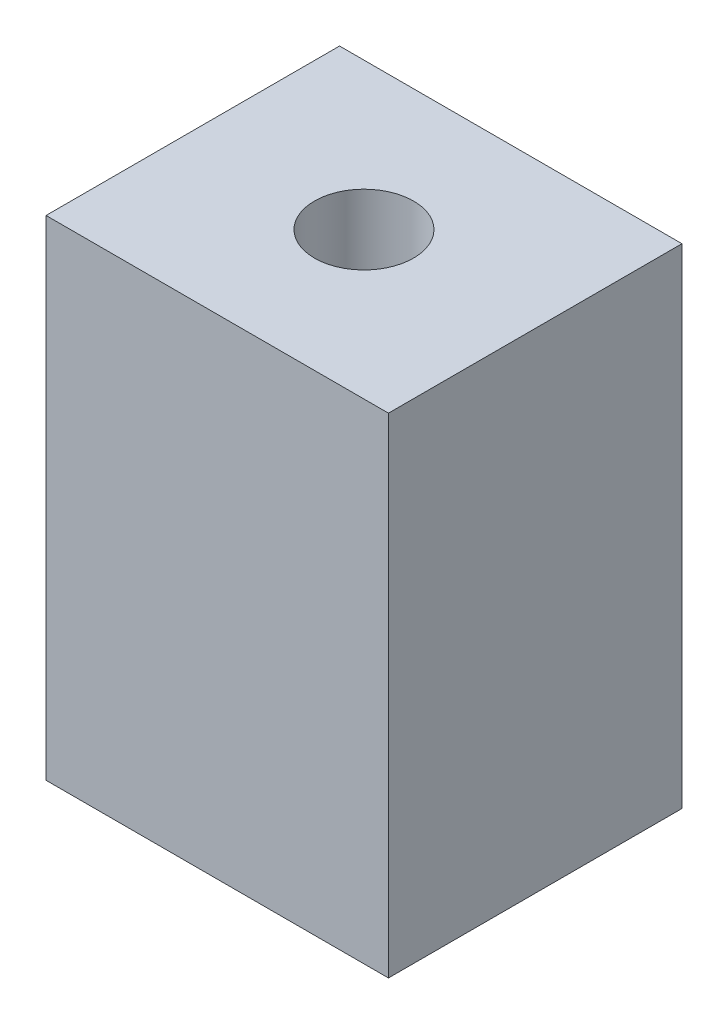
ISO-10303-21;
HEADER;
FILE_DESCRIPTION(('STEP AP214'),'2;1');
FILE_NAME('part.step','',(''),(''),'','','');
FILE_SCHEMA(('AUTOMOTIVE_DESIGN { 1 0 10303 214 1 1 1 1 }'));
ENDSEC;
DATA;
#1=APPLICATION_CONTEXT('core data for automotive mechanical design processes');
#2=APPLICATION_PROTOCOL_DEFINITION('international standard','automotive_design',2000,#1);
#3=PRODUCT_CONTEXT('',#1,'mechanical');
#4=PRODUCT('Part','Part','',(#3));
#5=PRODUCT_RELATED_PRODUCT_CATEGORY('part','',(#4));
#6=PRODUCT_DEFINITION_FORMATION('','',#4);
#7=PRODUCT_DEFINITION_CONTEXT('part definition',#1,'design');
#8=PRODUCT_DEFINITION('design','',#6,#7);
#9=PRODUCT_DEFINITION_SHAPE('','',#8);
#10=(LENGTH_UNIT() NAMED_UNIT(*) SI_UNIT(.MILLI.,.METRE.));
#11=(NAMED_UNIT(*) PLANE_ANGLE_UNIT() SI_UNIT($,.RADIAN.));
#12=(NAMED_UNIT(*) SI_UNIT($,.STERADIAN.) SOLID_ANGLE_UNIT());
#13=UNCERTAINTY_MEASURE_WITH_UNIT(LENGTH_MEASURE(1.E-05),#10,'distance_accuracy_value','');
#14=(GEOMETRIC_REPRESENTATION_CONTEXT(3) GLOBAL_UNCERTAINTY_ASSIGNED_CONTEXT((#13)) GLOBAL_UNIT_ASSIGNED_CONTEXT((#10,
#11,#12)) REPRESENTATION_CONTEXT('',''));
#15=CARTESIAN_POINT('',(0.,0.,0.));
#16=DIRECTION('',(0.,0.,1.));
#17=DIRECTION('',(1.,0.,0.));
#18=AXIS2_PLACEMENT_3D('',#15,#16,#17);
#19=CARTESIAN_POINT('',(1.74456666474761,50.,9.64810597925036));
#20=DIRECTION('',(1.,0.,0.));
#21=DIRECTION('',(0.,0.,-1.));
#22=AXIS2_PLACEMENT_3D('',#19,#20,#21);
#23=PLANE('',#22);
#24=DIRECTION('',(0.,0.,1.));
#25=VECTOR('',#24,1.);
#26=CARTESIAN_POINT('',(1.74456666474761,0.,9.64810597925036));
#27=LINE('',#26,#25);
#28=CARTESIAN_POINT('',(1.74456666474761,0.,-20.3518940207496));
#29=VERTEX_POINT('',#28);
#30=CARTESIAN_POINT('',(1.74456666474761,0.,9.64810597925036));
#31=VERTEX_POINT('',#30);
#32=EDGE_CURVE('E107',#29,#31,#27,.T.);
#33=ORIENTED_EDGE('',*,*,#32,.T.);
#34=DIRECTION('',(0.,-1.,0.));
#35=VECTOR('',#34,1.);
#36=CARTESIAN_POINT('',(1.74456666474761,50.,9.64810597925036));
#37=LINE('',#36,#35);
#38=CARTESIAN_POINT('',(1.74456666474761,50.,9.64810597925036));
#39=VERTEX_POINT('',#38);
#40=EDGE_CURVE('E11',#39,#31,#37,.T.);
#41=ORIENTED_EDGE('',*,*,#40,.F.);
#42=DIRECTION('',(0.,0.,1.));
#43=VECTOR('',#42,1.);
#44=CARTESIAN_POINT('',(1.74456666474761,50.,9.64810597925036));
#45=LINE('',#44,#43);
#46=CARTESIAN_POINT('',(1.74456666474761,50.,-20.3518940207496));
#47=VERTEX_POINT('',#46);
#48=EDGE_CURVE('E91',#47,#39,#45,.T.);
#49=ORIENTED_EDGE('',*,*,#48,.F.);
#50=DIRECTION('',(0.,-1.,0.));
#51=VECTOR('',#50,1.);
#52=CARTESIAN_POINT('',(1.74456666474761,50.,-20.3518940207496));
#53=LINE('',#52,#51);
#54=EDGE_CURVE('E103',#47,#29,#53,.T.);
#55=ORIENTED_EDGE('',*,*,#54,.T.);
#56=EDGE_LOOP('',(#33,#41,#49,#55));
#57=FACE_BOUND('',#56,.T.);
#58=ADVANCED_FACE('F39',(#57),#23,.F.);
#59=CARTESIAN_POINT('',(1.74456666474761,50.,9.64810597925036));
#60=DIRECTION('',(0.,0.,-1.));
#61=DIRECTION('',(-1.,0.,0.));
#62=AXIS2_PLACEMENT_3D('',#59,#60,#61);
#63=PLANE('',#62);
#64=DIRECTION('',(1.,0.,0.));
#65=VECTOR('',#64,1.);
#66=CARTESIAN_POINT('',(1.74456666474761,0.,9.64810597925036));
#67=LINE('',#66,#65);
#68=CARTESIAN_POINT('',(36.7445666647476,0.,9.64810597925036));
#69=VERTEX_POINT('',#68);
#70=EDGE_CURVE('E96',#31,#69,#67,.T.);
#71=ORIENTED_EDGE('',*,*,#70,.T.);
#72=DIRECTION('',(0.,-1.,0.));
#73=VECTOR('',#72,1.);
#74=CARTESIAN_POINT('',(36.7445666647476,50.,9.64810597925036));
#75=LINE('',#74,#73);
#76=CARTESIAN_POINT('',(36.7445666647476,50.,9.64810597925036));
#77=VERTEX_POINT('',#76);
#78=EDGE_CURVE('E48',#77,#69,#75,.T.);
#79=ORIENTED_EDGE('',*,*,#78,.F.);
#80=DIRECTION('',(1.,0.,0.));
#81=VECTOR('',#80,1.);
#82=CARTESIAN_POINT('',(1.74456666474761,50.,9.64810597925036));
#83=LINE('',#82,#81);
#84=EDGE_CURVE('E86',#39,#77,#83,.T.);
#85=ORIENTED_EDGE('',*,*,#84,.F.);
#86=ORIENTED_EDGE('',*,*,#40,.T.);
#87=EDGE_LOOP('',(#71,#79,#85,#86));
#88=FACE_BOUND('',#87,.T.);
#89=ADVANCED_FACE('F95',(#88),#63,.F.);
#90=CARTESIAN_POINT('',(36.7445666647476,50.,9.64810597925036));
#91=DIRECTION('',(-1.,0.,0.));
#92=DIRECTION('',(0.,0.,1.));
#93=AXIS2_PLACEMENT_3D('',#90,#91,#92);
#94=PLANE('',#93);
#95=DIRECTION('',(0.,0.,-1.));
#96=VECTOR('',#95,1.);
#97=CARTESIAN_POINT('',(36.7445666647476,0.,9.64810597925036));
#98=LINE('',#97,#96);
#99=CARTESIAN_POINT('',(36.7445666647476,0.,-20.3518940207496));
#100=VERTEX_POINT('',#99);
#101=EDGE_CURVE('E73',#69,#100,#98,.T.);
#102=ORIENTED_EDGE('',*,*,#101,.T.);
#103=DIRECTION('',(0.,-1.,0.));
#104=VECTOR('',#103,1.);
#105=CARTESIAN_POINT('',(36.7445666647476,50.,-20.3518940207496));
#106=LINE('',#105,#104);
#107=CARTESIAN_POINT('',(36.7445666647476,50.,-20.3518940207496));
#108=VERTEX_POINT('',#107);
#109=EDGE_CURVE('E98',#108,#100,#106,.T.);
#110=ORIENTED_EDGE('',*,*,#109,.F.);
#111=DIRECTION('',(0.,0.,-1.));
#112=VECTOR('',#111,1.);
#113=CARTESIAN_POINT('',(36.7445666647476,50.,9.64810597925036));
#114=LINE('',#113,#112);
#115=EDGE_CURVE('E89',#77,#108,#114,.T.);
#116=ORIENTED_EDGE('',*,*,#115,.F.);
#117=ORIENTED_EDGE('',*,*,#78,.T.);
#118=EDGE_LOOP('',(#102,#110,#116,#117));
#119=FACE_BOUND('',#118,.T.);
#120=ADVANCED_FACE('F99',(#119),#94,.F.);
#121=CARTESIAN_POINT('',(1.74456666474761,50.,-20.3518940207496));
#122=DIRECTION('',(0.,0.,1.));
#123=DIRECTION('',(1.,0.,0.));
#124=AXIS2_PLACEMENT_3D('',#121,#122,#123);
#125=PLANE('',#124);
#126=DIRECTION('',(-1.,0.,0.));
#127=VECTOR('',#126,1.);
#128=CARTESIAN_POINT('',(1.74456666474761,0.,-20.3518940207496));
#129=LINE('',#128,#127);
#130=EDGE_CURVE('E79',#100,#29,#129,.T.);
#131=ORIENTED_EDGE('',*,*,#130,.T.);
#132=ORIENTED_EDGE('',*,*,#54,.F.);
#133=DIRECTION('',(-1.,0.,0.));
#134=VECTOR('',#133,1.);
#135=CARTESIAN_POINT('',(1.74456666474761,50.,-20.3518940207496));
#136=LINE('',#135,#134);
#137=EDGE_CURVE('E56',#108,#47,#136,.T.);
#138=ORIENTED_EDGE('',*,*,#137,.F.);
#139=ORIENTED_EDGE('',*,*,#109,.T.);
#140=EDGE_LOOP('',(#131,#132,#138,#139));
#141=FACE_BOUND('',#140,.T.);
#142=ADVANCED_FACE('F121',(#141),#125,.F.);
#143=CARTESIAN_POINT('',(0.,50.,0.));
#144=DIRECTION('',(0.,-1.,0.));
#145=DIRECTION('',(0.,0.,-1.));
#146=AXIS2_PLACEMENT_3D('',#143,#144,#145);
#147=PLANE('',#146);
#148=CARTESIAN_POINT('',(19.2445666647476,50.,-5.35189402074964));
#149=DIRECTION('',(0.,1.,0.));
#150=DIRECTION('',(0.,0.,1.));
#151=AXIS2_PLACEMENT_3D('',#148,#149,#150);
#152=CIRCLE('',#151,5.06067210370366);
#153=CARTESIAN_POINT('',(19.2445666647476,50.,-0.291221917045978));
#154=VERTEX_POINT('',#153);
#155=EDGE_CURVE('E128',#154,#154,#152,.T.);
#156=ORIENTED_EDGE('',*,*,#155,.F.);
#157=EDGE_LOOP('',(#156));
#158=FACE_BOUND('',#157,.T.);
#159=ORIENTED_EDGE('',*,*,#48,.T.);
#160=ORIENTED_EDGE('',*,*,#84,.T.);
#161=ORIENTED_EDGE('',*,*,#115,.T.);
#162=ORIENTED_EDGE('',*,*,#137,.T.);
#163=EDGE_LOOP('',(#159,#160,#161,#162));
#164=FACE_BOUND('',#163,.T.);
#165=ADVANCED_FACE('F87',(#158,#164),#147,.F.);
#166=CARTESIAN_POINT('',(0.,0.,0.));
#167=DIRECTION('',(0.,-1.,0.));
#168=DIRECTION('',(0.,0.,-1.));
#169=AXIS2_PLACEMENT_3D('',#166,#167,#168);
#170=PLANE('',#169);
#171=ORIENTED_EDGE('',*,*,#32,.F.);
#172=ORIENTED_EDGE('',*,*,#130,.F.);
#173=ORIENTED_EDGE('',*,*,#101,.F.);
#174=ORIENTED_EDGE('',*,*,#70,.F.);
#175=EDGE_LOOP('',(#171,#172,#173,#174));
#176=FACE_BOUND('',#175,.T.);
#177=ADVANCED_FACE('F124',(#176),#170,.T.);
#178=CARTESIAN_POINT('',(19.2445666647476,10.,-5.35189402074964));
#179=DIRECTION('',(0.,1.,0.));
#180=DIRECTION('',(0.,0.,1.));
#181=AXIS2_PLACEMENT_3D('',#178,#179,#180);
#182=CYLINDRICAL_SURFACE('',#181,5.06067210370366);
#183=CARTESIAN_POINT('',(19.2445666647476,10.,-5.35189402074964));
#184=DIRECTION('',(0.,1.,0.));
#185=DIRECTION('',(0.,0.,1.));
#186=AXIS2_PLACEMENT_3D('',#183,#184,#185);
#187=CIRCLE('',#186,5.06067210370366);
#188=CARTESIAN_POINT('',(19.2445666647476,10.,-0.291221917045978));
#189=VERTEX_POINT('',#188);
#190=EDGE_CURVE('E111',#189,#189,#187,.T.);
#191=ORIENTED_EDGE('',*,*,#190,.F.);
#192=EDGE_LOOP('',(#191));
#193=FACE_BOUND('',#192,.T.);
#194=ORIENTED_EDGE('',*,*,#155,.T.);
#195=EDGE_LOOP('',(#194));
#196=FACE_BOUND('',#195,.T.);
#197=ADVANCED_FACE('F138',(#193,#196),#182,.F.);
#198=CARTESIAN_POINT('',(19.2445666647476,10.,-5.35189402074964));
#199=DIRECTION('',(0.,1.,0.));
#200=DIRECTION('',(0.,0.,1.));
#201=AXIS2_PLACEMENT_3D('',#198,#199,#200);
#202=PLANE('',#201);
#203=ORIENTED_EDGE('',*,*,#190,.T.);
#204=EDGE_LOOP('',(#203));
#205=FACE_BOUND('',#204,.T.);
#206=ADVANCED_FACE('F136',(#205),#202,.T.);
#207=CLOSED_SHELL('',(#58,#89,#120,#142,#165,#177,#197,#206));
#208=MANIFOLD_SOLID_BREP('B2',#207);
#209=ADVANCED_BREP_SHAPE_REPRESENTATION('',(#18,#208),#14);
#210=SHAPE_DEFINITION_REPRESENTATION(#9,#209);
ENDSEC;
END-ISO-10303-21;
